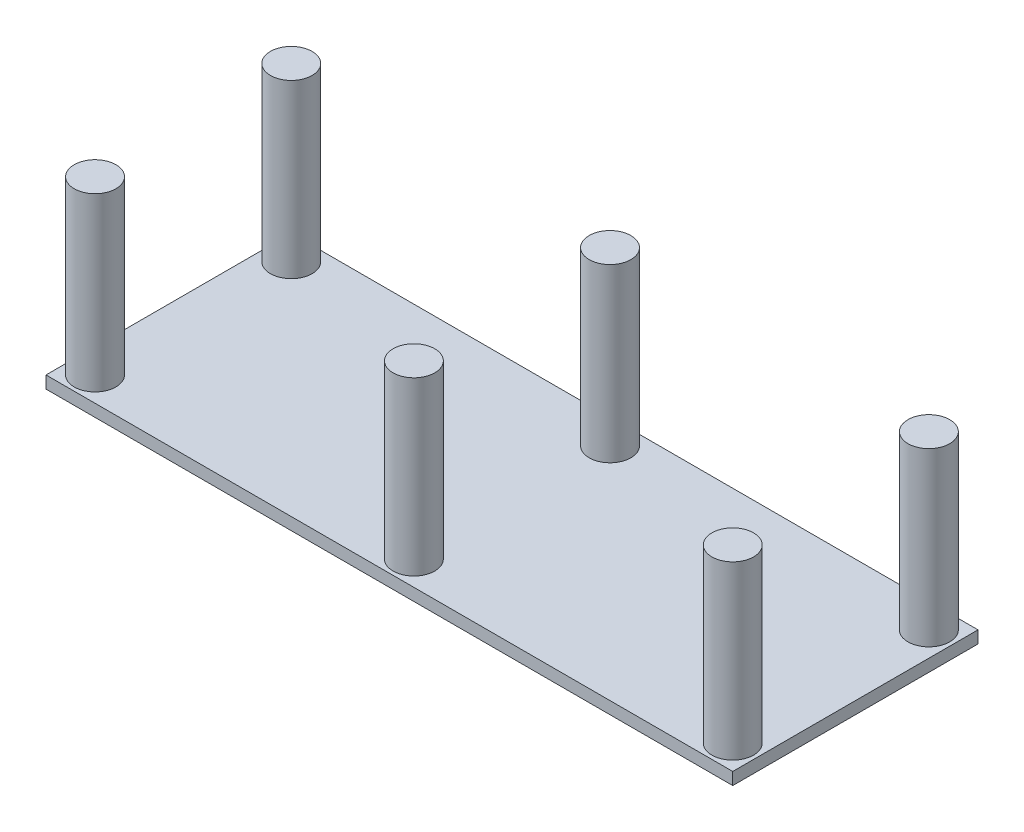
ISO-10303-21;
HEADER;
FILE_DESCRIPTION(('STEP AP214'),'2;1');
FILE_NAME('part.step','',(''),(''),'','','');
FILE_SCHEMA(('AUTOMOTIVE_DESIGN { 1 0 10303 214 1 1 1 1 }'));
ENDSEC;
DATA;
#1=APPLICATION_CONTEXT('core data for automotive mechanical design processes');
#2=APPLICATION_PROTOCOL_DEFINITION('international standard','automotive_design',2000,#1);
#3=PRODUCT_CONTEXT('',#1,'mechanical');
#4=PRODUCT('Part','Part','',(#3));
#5=PRODUCT_RELATED_PRODUCT_CATEGORY('part','',(#4));
#6=PRODUCT_DEFINITION_FORMATION('','',#4);
#7=PRODUCT_DEFINITION_CONTEXT('part definition',#1,'design');
#8=PRODUCT_DEFINITION('design','',#6,#7);
#9=PRODUCT_DEFINITION_SHAPE('','',#8);
#10=(LENGTH_UNIT() NAMED_UNIT(*) SI_UNIT(.MILLI.,.METRE.));
#11=(NAMED_UNIT(*) PLANE_ANGLE_UNIT() SI_UNIT($,.RADIAN.));
#12=(NAMED_UNIT(*) SI_UNIT($,.STERADIAN.) SOLID_ANGLE_UNIT());
#13=UNCERTAINTY_MEASURE_WITH_UNIT(LENGTH_MEASURE(1.E-05),#10,'distance_accuracy_value','');
#14=(GEOMETRIC_REPRESENTATION_CONTEXT(3) GLOBAL_UNCERTAINTY_ASSIGNED_CONTEXT((#13)) GLOBAL_UNIT_ASSIGNED_CONTEXT((#10,
#11,#12)) REPRESENTATION_CONTEXT('',''));
#15=CARTESIAN_POINT('',(0.,0.,0.));
#16=DIRECTION('',(0.,0.,1.));
#17=DIRECTION('',(1.,0.,0.));
#18=AXIS2_PLACEMENT_3D('',#15,#16,#17);
#19=CARTESIAN_POINT('',(0.,5.,20.));
#20=DIRECTION('',(0.,0.,-1.));
#21=DIRECTION('',(-1.,0.,0.));
#22=AXIS2_PLACEMENT_3D('',#19,#20,#21);
#23=PLANE('',#22);
#24=DIRECTION('',(1.,0.,0.));
#25=VECTOR('',#24,1.);
#26=CARTESIAN_POINT('',(0.,0.,20.));
#27=LINE('',#26,#25);
#28=CARTESIAN_POINT('',(-20.,0.,20.));
#29=VERTEX_POINT('',#28);
#30=CARTESIAN_POINT('',(260.,0.,20.));
#31=VERTEX_POINT('',#30);
#32=EDGE_CURVE('E155',#29,#31,#27,.T.);
#33=ORIENTED_EDGE('',*,*,#32,.T.);
#34=DIRECTION('',(0.,-1.,0.));
#35=VECTOR('',#34,1.);
#36=CARTESIAN_POINT('',(260.,5.,20.));
#37=LINE('',#36,#35);
#38=CARTESIAN_POINT('',(260.,5.,20.));
#39=VERTEX_POINT('',#38);
#40=EDGE_CURVE('E105',#39,#31,#37,.T.);
#41=ORIENTED_EDGE('',*,*,#40,.F.);
#42=DIRECTION('',(1.,0.,0.));
#43=VECTOR('',#42,1.);
#44=CARTESIAN_POINT('',(0.,5.,20.));
#45=LINE('',#44,#43);
#46=CARTESIAN_POINT('',(-20.,5.,20.));
#47=VERTEX_POINT('',#46);
#48=EDGE_CURVE('E147',#47,#39,#45,.T.);
#49=ORIENTED_EDGE('',*,*,#48,.F.);
#50=DIRECTION('',(0.,-1.,0.));
#51=VECTOR('',#50,1.);
#52=CARTESIAN_POINT('',(-20.,5.,20.));
#53=LINE('',#52,#51);
#54=EDGE_CURVE('E12',#47,#29,#53,.T.);
#55=ORIENTED_EDGE('',*,*,#54,.T.);
#56=EDGE_LOOP('',(#33,#41,#49,#55));
#57=FACE_BOUND('',#56,.T.);
#58=ADVANCED_FACE('F96',(#57),#23,.F.);
#59=CARTESIAN_POINT('',(260.,5.,0.));
#60=DIRECTION('',(-1.,0.,0.));
#61=DIRECTION('',(0.,0.,1.));
#62=AXIS2_PLACEMENT_3D('',#59,#60,#61);
#63=PLANE('',#62);
#64=DIRECTION('',(0.,0.,-1.));
#65=VECTOR('',#64,1.);
#66=CARTESIAN_POINT('',(260.,0.,0.));
#67=LINE('',#66,#65);
#68=CARTESIAN_POINT('',(260.,0.,-80.));
#69=VERTEX_POINT('',#68);
#70=EDGE_CURVE('E162',#31,#69,#67,.T.);
#71=ORIENTED_EDGE('',*,*,#70,.T.);
#72=DIRECTION('',(0.,-1.,0.));
#73=VECTOR('',#72,1.);
#74=CARTESIAN_POINT('',(260.,5.,-80.));
#75=LINE('',#74,#73);
#76=CARTESIAN_POINT('',(260.,5.,-80.));
#77=VERTEX_POINT('',#76);
#78=EDGE_CURVE('E127',#77,#69,#75,.T.);
#79=ORIENTED_EDGE('',*,*,#78,.F.);
#80=DIRECTION('',(0.,0.,-1.));
#81=VECTOR('',#80,1.);
#82=CARTESIAN_POINT('',(260.,5.,0.));
#83=LINE('',#82,#81);
#84=EDGE_CURVE('E139',#39,#77,#83,.T.);
#85=ORIENTED_EDGE('',*,*,#84,.F.);
#86=ORIENTED_EDGE('',*,*,#40,.T.);
#87=EDGE_LOOP('',(#71,#79,#85,#86));
#88=FACE_BOUND('',#87,.T.);
#89=ADVANCED_FACE('F141',(#88),#63,.F.);
#90=CARTESIAN_POINT('',(0.,5.,-80.));
#91=DIRECTION('',(0.,0.,-1.));
#92=DIRECTION('',(-1.,0.,0.));
#93=AXIS2_PLACEMENT_3D('',#90,#91,#92);
#94=PLANE('',#93);
#95=DIRECTION('',(1.,0.,0.));
#96=VECTOR('',#95,1.);
#97=CARTESIAN_POINT('',(0.,0.,-80.));
#98=LINE('',#97,#96);
#99=CARTESIAN_POINT('',(-20.,0.,-80.));
#100=VERTEX_POINT('',#99);
#101=EDGE_CURVE('E159',#100,#69,#98,.T.);
#102=ORIENTED_EDGE('',*,*,#101,.F.);
#103=DIRECTION('',(0.,-1.,0.));
#104=VECTOR('',#103,1.);
#105=CARTESIAN_POINT('',(-20.,5.,-80.));
#106=LINE('',#105,#104);
#107=CARTESIAN_POINT('',(-20.,5.,-80.));
#108=VERTEX_POINT('',#107);
#109=EDGE_CURVE('E113',#108,#100,#106,.T.);
#110=ORIENTED_EDGE('',*,*,#109,.F.);
#111=DIRECTION('',(1.,0.,0.));
#112=VECTOR('',#111,1.);
#113=CARTESIAN_POINT('',(0.,5.,-80.));
#114=LINE('',#113,#112);
#115=EDGE_CURVE('E146',#108,#77,#114,.T.);
#116=ORIENTED_EDGE('',*,*,#115,.T.);
#117=ORIENTED_EDGE('',*,*,#78,.T.);
#118=EDGE_LOOP('',(#102,#110,#116,#117));
#119=FACE_BOUND('',#118,.T.);
#120=ADVANCED_FACE('F245',(#119),#94,.T.);
#121=CARTESIAN_POINT('',(-20.,5.,0.));
#122=DIRECTION('',(-1.,0.,0.));
#123=DIRECTION('',(0.,0.,1.));
#124=AXIS2_PLACEMENT_3D('',#121,#122,#123);
#125=PLANE('',#124);
#126=DIRECTION('',(0.,0.,-1.));
#127=VECTOR('',#126,1.);
#128=CARTESIAN_POINT('',(-20.,0.,0.));
#129=LINE('',#128,#127);
#130=EDGE_CURVE('E165',#29,#100,#129,.T.);
#131=ORIENTED_EDGE('',*,*,#130,.F.);
#132=ORIENTED_EDGE('',*,*,#54,.F.);
#133=DIRECTION('',(0.,0.,-1.));
#134=VECTOR('',#133,1.);
#135=CARTESIAN_POINT('',(-20.,5.,0.));
#136=LINE('',#135,#134);
#137=EDGE_CURVE('E151',#47,#108,#136,.T.);
#138=ORIENTED_EDGE('',*,*,#137,.T.);
#139=ORIENTED_EDGE('',*,*,#109,.T.);
#140=EDGE_LOOP('',(#131,#132,#138,#139));
#141=FACE_BOUND('',#140,.T.);
#142=ADVANCED_FACE('F98',(#141),#125,.T.);
#143=CARTESIAN_POINT('',(0.,0.,0.));
#144=DIRECTION('',(0.,1.,0.));
#145=DIRECTION('',(0.,0.,1.));
#146=AXIS2_PLACEMENT_3D('',#143,#144,#145);
#147=PLANE('',#146);
#148=ORIENTED_EDGE('',*,*,#130,.T.);
#149=ORIENTED_EDGE('',*,*,#101,.T.);
#150=ORIENTED_EDGE('',*,*,#70,.F.);
#151=ORIENTED_EDGE('',*,*,#32,.F.);
#152=EDGE_LOOP('',(#148,#149,#150,#151));
#153=FACE_BOUND('',#152,.T.);
#154=ADVANCED_FACE('F218',(#153),#147,.F.);
#155=CARTESIAN_POINT('',(0.,5.,0.));
#156=DIRECTION('',(0.,1.,0.));
#157=DIRECTION('',(0.,0.,1.));
#158=AXIS2_PLACEMENT_3D('',#155,#156,#157);
#159=PLANE('',#158);
#160=CARTESIAN_POINT('',(120.,5.,9.99999999999997));
#161=DIRECTION('',(0.,1.,0.));
#162=DIRECTION('',(0.,0.,1.));
#163=AXIS2_PLACEMENT_3D('',#160,#161,#162);
#164=CIRCLE('',#163,8.5);
#165=CARTESIAN_POINT('',(120.,5.,18.5));
#166=VERTEX_POINT('',#165);
#167=EDGE_CURVE('E200',#166,#166,#164,.T.);
#168=ORIENTED_EDGE('',*,*,#167,.F.);
#169=EDGE_LOOP('',(#168));
#170=FACE_BOUND('',#169,.T.);
#171=CARTESIAN_POINT('',(120.,5.,-69.9664284556371));
#172=DIRECTION('',(0.,1.,0.));
#173=DIRECTION('',(0.,0.,1.));
#174=AXIS2_PLACEMENT_3D('',#171,#172,#173);
#175=CIRCLE('',#174,8.49999999999999);
#176=CARTESIAN_POINT('',(120.,5.,-61.4664284556371));
#177=VERTEX_POINT('',#176);
#178=EDGE_CURVE('E194',#177,#177,#175,.T.);
#179=ORIENTED_EDGE('',*,*,#178,.F.);
#180=EDGE_LOOP('',(#179));
#181=FACE_BOUND('',#180,.T.);
#182=CARTESIAN_POINT('',(250.,5.,9.99999999999997));
#183=DIRECTION('',(0.,1.,0.));
#184=DIRECTION('',(0.,0.,1.));
#185=AXIS2_PLACEMENT_3D('',#182,#183,#184);
#186=CIRCLE('',#185,8.50000000000001);
#187=CARTESIAN_POINT('',(250.,5.,18.5));
#188=VERTEX_POINT('',#187);
#189=EDGE_CURVE('E188',#188,#188,#186,.T.);
#190=ORIENTED_EDGE('',*,*,#189,.F.);
#191=EDGE_LOOP('',(#190));
#192=FACE_BOUND('',#191,.T.);
#193=CARTESIAN_POINT('',(250.,5.,-69.9664284556371));
#194=DIRECTION('',(0.,1.,0.));
#195=DIRECTION('',(0.,0.,-1.));
#196=AXIS2_PLACEMENT_3D('',#193,#194,#195);
#197=CIRCLE('',#196,8.50000000000001);
#198=CARTESIAN_POINT('',(250.,5.,-78.4664284556371));
#199=VERTEX_POINT('',#198);
#200=EDGE_CURVE('E182',#199,#199,#197,.T.);
#201=ORIENTED_EDGE('',*,*,#200,.F.);
#202=EDGE_LOOP('',(#201));
#203=FACE_BOUND('',#202,.T.);
#204=CARTESIAN_POINT('',(-9.99999999999999,5.,9.99999999999997));
#205=DIRECTION('',(0.,1.,0.));
#206=DIRECTION('',(0.,0.,-1.));
#207=AXIS2_PLACEMENT_3D('',#204,#205,#206);
#208=CIRCLE('',#207,8.5);
#209=CARTESIAN_POINT('',(-9.99999999999999,5.,1.49999999999997));
#210=VERTEX_POINT('',#209);
#211=EDGE_CURVE('E176',#210,#210,#208,.T.);
#212=ORIENTED_EDGE('',*,*,#211,.F.);
#213=EDGE_LOOP('',(#212));
#214=FACE_BOUND('',#213,.T.);
#215=CARTESIAN_POINT('',(-9.99999999999999,5.,-70.));
#216=DIRECTION('',(0.,1.,0.));
#217=DIRECTION('',(0.,0.,1.));
#218=AXIS2_PLACEMENT_3D('',#215,#216,#217);
#219=CIRCLE('',#218,8.5);
#220=CARTESIAN_POINT('',(-9.99999999999999,5.,-61.5));
#221=VERTEX_POINT('',#220);
#222=EDGE_CURVE('E170',#221,#221,#219,.T.);
#223=ORIENTED_EDGE('',*,*,#222,.F.);
#224=EDGE_LOOP('',(#223));
#225=FACE_BOUND('',#224,.T.);
#226=ORIENTED_EDGE('',*,*,#137,.F.);
#227=ORIENTED_EDGE('',*,*,#48,.T.);
#228=ORIENTED_EDGE('',*,*,#84,.T.);
#229=ORIENTED_EDGE('',*,*,#115,.F.);
#230=EDGE_LOOP('',(#226,#227,#228,#229));
#231=FACE_BOUND('',#230,.T.);
#232=ADVANCED_FACE('F150',(#170,#181,#192,#203,#214,#225,#231),#159,.T.);
#233=CARTESIAN_POINT('',(-9.99999999999999,75.,-70.));
#234=DIRECTION('',(0.,-1.,0.));
#235=DIRECTION('',(0.,0.,-1.));
#236=AXIS2_PLACEMENT_3D('',#233,#234,#235);
#237=CYLINDRICAL_SURFACE('',#236,8.5);
#238=CARTESIAN_POINT('',(-9.99999999999999,75.,-70.));
#239=DIRECTION('',(0.,1.,0.));
#240=DIRECTION('',(0.,0.,1.));
#241=AXIS2_PLACEMENT_3D('',#238,#239,#240);
#242=CIRCLE('',#241,8.5);
#243=CARTESIAN_POINT('',(-9.99999999999999,75.,-61.5));
#244=VERTEX_POINT('',#243);
#245=EDGE_CURVE('E167',#244,#244,#242,.T.);
#246=ORIENTED_EDGE('',*,*,#245,.F.);
#247=EDGE_LOOP('',(#246));
#248=FACE_BOUND('',#247,.T.);
#249=ORIENTED_EDGE('',*,*,#222,.T.);
#250=EDGE_LOOP('',(#249));
#251=FACE_BOUND('',#250,.T.);
#252=ADVANCED_FACE('F217',(#248,#251),#237,.T.);
#253=CARTESIAN_POINT('',(-9.99999999999999,75.,-70.));
#254=DIRECTION('',(0.,1.,0.));
#255=DIRECTION('',(0.,0.,1.));
#256=AXIS2_PLACEMENT_3D('',#253,#254,#255);
#257=PLANE('',#256);
#258=ORIENTED_EDGE('',*,*,#245,.T.);
#259=EDGE_LOOP('',(#258));
#260=FACE_BOUND('',#259,.T.);
#261=ADVANCED_FACE('F231',(#260),#257,.T.);
#262=CARTESIAN_POINT('',(-9.99999999999999,75.,9.99999999999997));
#263=DIRECTION('',(0.,-1.,0.));
#264=DIRECTION('',(0.,0.,-1.));
#265=AXIS2_PLACEMENT_3D('',#262,#263,#264);
#266=CYLINDRICAL_SURFACE('',#265,8.5);
#267=CARTESIAN_POINT('',(-9.99999999999999,75.,9.99999999999997));
#268=DIRECTION('',(0.,1.,0.));
#269=DIRECTION('',(0.,0.,-1.));
#270=AXIS2_PLACEMENT_3D('',#267,#268,#269);
#271=CIRCLE('',#270,8.5);
#272=CARTESIAN_POINT('',(-9.99999999999999,75.,1.49999999999997));
#273=VERTEX_POINT('',#272);
#274=EDGE_CURVE('E173',#273,#273,#271,.T.);
#275=ORIENTED_EDGE('',*,*,#274,.F.);
#276=EDGE_LOOP('',(#275));
#277=FACE_BOUND('',#276,.T.);
#278=ORIENTED_EDGE('',*,*,#211,.T.);
#279=EDGE_LOOP('',(#278));
#280=FACE_BOUND('',#279,.T.);
#281=ADVANCED_FACE('F237',(#277,#280),#266,.T.);
#282=CARTESIAN_POINT('',(-9.99999999999999,75.,9.99999999999997));
#283=DIRECTION('',(0.,-1.,0.));
#284=DIRECTION('',(0.,0.,-1.));
#285=AXIS2_PLACEMENT_3D('',#282,#283,#284);
#286=PLANE('',#285);
#287=ORIENTED_EDGE('',*,*,#274,.T.);
#288=EDGE_LOOP('',(#287));
#289=FACE_BOUND('',#288,.T.);
#290=ADVANCED_FACE('F301',(#289),#286,.F.);
#291=CARTESIAN_POINT('',(250.,75.,-69.9664284556371));
#292=DIRECTION('',(0.,-1.,0.));
#293=DIRECTION('',(0.,0.,-1.));
#294=AXIS2_PLACEMENT_3D('',#291,#292,#293);
#295=CYLINDRICAL_SURFACE('',#294,8.50000000000001);
#296=CARTESIAN_POINT('',(250.,75.,-69.9664284556371));
#297=DIRECTION('',(0.,1.,0.));
#298=DIRECTION('',(0.,0.,-1.));
#299=AXIS2_PLACEMENT_3D('',#296,#297,#298);
#300=CIRCLE('',#299,8.50000000000001);
#301=CARTESIAN_POINT('',(250.,75.,-78.4664284556371));
#302=VERTEX_POINT('',#301);
#303=EDGE_CURVE('E179',#302,#302,#300,.T.);
#304=ORIENTED_EDGE('',*,*,#303,.F.);
#305=EDGE_LOOP('',(#304));
#306=FACE_BOUND('',#305,.T.);
#307=ORIENTED_EDGE('',*,*,#200,.T.);
#308=EDGE_LOOP('',(#307));
#309=FACE_BOUND('',#308,.T.);
#310=ADVANCED_FACE('F310',(#306,#309),#295,.T.);
#311=CARTESIAN_POINT('',(250.,75.,-69.9664284556371));
#312=DIRECTION('',(0.,-1.,0.));
#313=DIRECTION('',(0.,0.,-1.));
#314=AXIS2_PLACEMENT_3D('',#311,#312,#313);
#315=PLANE('',#314);
#316=ORIENTED_EDGE('',*,*,#303,.T.);
#317=EDGE_LOOP('',(#316));
#318=FACE_BOUND('',#317,.T.);
#319=ADVANCED_FACE('F319',(#318),#315,.F.);
#320=CARTESIAN_POINT('',(250.,75.,9.99999999999997));
#321=DIRECTION('',(0.,-1.,0.));
#322=DIRECTION('',(0.,0.,-1.));
#323=AXIS2_PLACEMENT_3D('',#320,#321,#322);
#324=CYLINDRICAL_SURFACE('',#323,8.50000000000001);
#325=CARTESIAN_POINT('',(250.,75.,9.99999999999997));
#326=DIRECTION('',(0.,1.,0.));
#327=DIRECTION('',(0.,0.,1.));
#328=AXIS2_PLACEMENT_3D('',#325,#326,#327);
#329=CIRCLE('',#328,8.50000000000001);
#330=CARTESIAN_POINT('',(250.,75.,18.5));
#331=VERTEX_POINT('',#330);
#332=EDGE_CURVE('E185',#331,#331,#329,.T.);
#333=ORIENTED_EDGE('',*,*,#332,.F.);
#334=EDGE_LOOP('',(#333));
#335=FACE_BOUND('',#334,.T.);
#336=ORIENTED_EDGE('',*,*,#189,.T.);
#337=EDGE_LOOP('',(#336));
#338=FACE_BOUND('',#337,.T.);
#339=ADVANCED_FACE('F328',(#335,#338),#324,.T.);
#340=CARTESIAN_POINT('',(250.,75.,9.99999999999997));
#341=DIRECTION('',(0.,1.,0.));
#342=DIRECTION('',(0.,0.,1.));
#343=AXIS2_PLACEMENT_3D('',#340,#341,#342);
#344=PLANE('',#343);
#345=ORIENTED_EDGE('',*,*,#332,.T.);
#346=EDGE_LOOP('',(#345));
#347=FACE_BOUND('',#346,.T.);
#348=ADVANCED_FACE('F337',(#347),#344,.T.);
#349=CARTESIAN_POINT('',(120.,75.,-69.9664284556371));
#350=DIRECTION('',(0.,-1.,0.));
#351=DIRECTION('',(0.,0.,-1.));
#352=AXIS2_PLACEMENT_3D('',#349,#350,#351);
#353=CYLINDRICAL_SURFACE('',#352,8.49999999999999);
#354=CARTESIAN_POINT('',(120.,75.,-69.9664284556371));
#355=DIRECTION('',(0.,1.,0.));
#356=DIRECTION('',(0.,0.,1.));
#357=AXIS2_PLACEMENT_3D('',#354,#355,#356);
#358=CIRCLE('',#357,8.49999999999999);
#359=CARTESIAN_POINT('',(120.,75.,-61.4664284556371));
#360=VERTEX_POINT('',#359);
#361=EDGE_CURVE('E191',#360,#360,#358,.T.);
#362=ORIENTED_EDGE('',*,*,#361,.F.);
#363=EDGE_LOOP('',(#362));
#364=FACE_BOUND('',#363,.T.);
#365=ORIENTED_EDGE('',*,*,#178,.T.);
#366=EDGE_LOOP('',(#365));
#367=FACE_BOUND('',#366,.T.);
#368=ADVANCED_FACE('F346',(#364,#367),#353,.T.);
#369=CARTESIAN_POINT('',(120.,75.,-69.9664284556371));
#370=DIRECTION('',(0.,1.,0.));
#371=DIRECTION('',(0.,0.,1.));
#372=AXIS2_PLACEMENT_3D('',#369,#370,#371);
#373=PLANE('',#372);
#374=ORIENTED_EDGE('',*,*,#361,.T.);
#375=EDGE_LOOP('',(#374));
#376=FACE_BOUND('',#375,.T.);
#377=ADVANCED_FACE('F211',(#376),#373,.T.);
#378=CARTESIAN_POINT('',(120.,75.,9.99999999999997));
#379=DIRECTION('',(0.,-1.,0.));
#380=DIRECTION('',(0.,0.,-1.));
#381=AXIS2_PLACEMENT_3D('',#378,#379,#380);
#382=CYLINDRICAL_SURFACE('',#381,8.5);
#383=CARTESIAN_POINT('',(120.,75.,9.99999999999997));
#384=DIRECTION('',(0.,1.,0.));
#385=DIRECTION('',(0.,0.,1.));
#386=AXIS2_PLACEMENT_3D('',#383,#384,#385);
#387=CIRCLE('',#386,8.5);
#388=CARTESIAN_POINT('',(120.,75.,18.5));
#389=VERTEX_POINT('',#388);
#390=EDGE_CURVE('E197',#389,#389,#387,.T.);
#391=ORIENTED_EDGE('',*,*,#390,.F.);
#392=EDGE_LOOP('',(#391));
#393=FACE_BOUND('',#392,.T.);
#394=ORIENTED_EDGE('',*,*,#167,.T.);
#395=EDGE_LOOP('',(#394));
#396=FACE_BOUND('',#395,.T.);
#397=ADVANCED_FACE('F208',(#393,#396),#382,.T.);
#398=CARTESIAN_POINT('',(120.,75.,9.99999999999997));
#399=DIRECTION('',(0.,1.,0.));
#400=DIRECTION('',(0.,0.,1.));
#401=AXIS2_PLACEMENT_3D('',#398,#399,#400);
#402=PLANE('',#401);
#403=ORIENTED_EDGE('',*,*,#390,.T.);
#404=EDGE_LOOP('',(#403));
#405=FACE_BOUND('',#404,.T.);
#406=ADVANCED_FACE('F206',(#405),#402,.T.);
#407=CLOSED_SHELL('',(#58,#89,#120,#142,#154,#232,#252,#261,#281,#290,#310,#319,#339,#348,#368,
#377,#397,#406));
#408=MANIFOLD_SOLID_BREP('B2',#407);
#409=ADVANCED_BREP_SHAPE_REPRESENTATION('',(#18,#408),#14);
#410=SHAPE_DEFINITION_REPRESENTATION(#9,#409);
ENDSEC;
END-ISO-10303-21;
